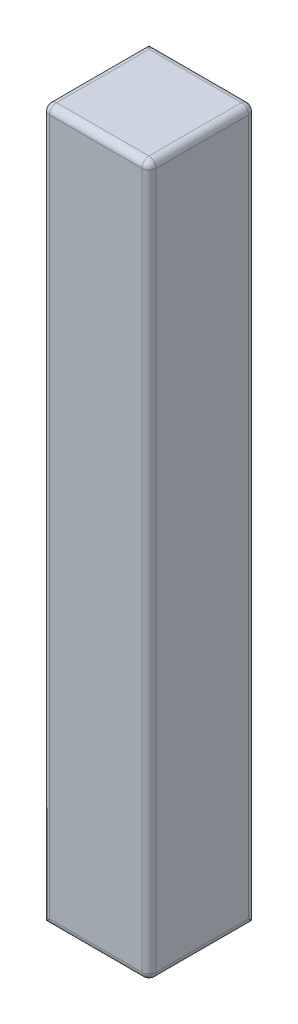
ISO-10303-21;
HEADER;
FILE_DESCRIPTION(('STEP AP214'),'2;1');
FILE_NAME('part.step','',(''),(''),'','','');
FILE_SCHEMA(('AUTOMOTIVE_DESIGN { 1 0 10303 214 1 1 1 1 }'));
ENDSEC;
DATA;
#1=APPLICATION_CONTEXT('core data for automotive mechanical design processes');
#2=APPLICATION_PROTOCOL_DEFINITION('international standard','automotive_design',2000,#1);
#3=PRODUCT_CONTEXT('',#1,'mechanical');
#4=PRODUCT('Part','Part','',(#3));
#5=PRODUCT_RELATED_PRODUCT_CATEGORY('part','',(#4));
#6=PRODUCT_DEFINITION_FORMATION('','',#4);
#7=PRODUCT_DEFINITION_CONTEXT('part definition',#1,'design');
#8=PRODUCT_DEFINITION('design','',#6,#7);
#9=PRODUCT_DEFINITION_SHAPE('','',#8);
#10=(LENGTH_UNIT() NAMED_UNIT(*) SI_UNIT(.MILLI.,.METRE.));
#11=(NAMED_UNIT(*) PLANE_ANGLE_UNIT() SI_UNIT($,.RADIAN.));
#12=(NAMED_UNIT(*) SI_UNIT($,.STERADIAN.) SOLID_ANGLE_UNIT());
#13=UNCERTAINTY_MEASURE_WITH_UNIT(LENGTH_MEASURE(1.E-05),#10,'distance_accuracy_value','');
#14=(GEOMETRIC_REPRESENTATION_CONTEXT(3) GLOBAL_UNCERTAINTY_ASSIGNED_CONTEXT((#13)) GLOBAL_UNIT_ASSIGNED_CONTEXT((#10,
#11,#12)) REPRESENTATION_CONTEXT('',''));
#15=CARTESIAN_POINT('',(0.,0.,0.));
#16=DIRECTION('',(0.,0.,1.));
#17=DIRECTION('',(1.,0.,0.));
#18=AXIS2_PLACEMENT_3D('',#15,#16,#17);
#19=CARTESIAN_POINT('',(0.,20.,0.));
#20=DIRECTION('',(1.,0.,0.));
#21=DIRECTION('',(0.,0.,-1.));
#22=AXIS2_PLACEMENT_3D('',#19,#20,#21);
#23=PLANE('',#22);
#24=DIRECTION('',(0.,-1.,0.));
#25=VECTOR('',#24,1.);
#26=CARTESIAN_POINT('',(0.,20.,-0.2));
#27=LINE('',#26,#25);
#28=CARTESIAN_POINT('',(0.,0.,-0.2));
#29=VERTEX_POINT('',#28);
#30=CARTESIAN_POINT('',(0.,19.8,-0.2));
#31=VERTEX_POINT('',#30);
#32=EDGE_CURVE('E57',#29,#31,#27,.F.);
#33=ORIENTED_EDGE('',*,*,#32,.T.);
#34=DIRECTION('',(0.,0.,1.));
#35=VECTOR('',#34,1.);
#36=CARTESIAN_POINT('',(0.,19.8,0.));
#37=LINE('',#36,#35);
#38=CARTESIAN_POINT('',(0.,19.8,-3.));
#39=VERTEX_POINT('',#38);
#40=EDGE_CURVE('E111',#31,#39,#37,.F.);
#41=ORIENTED_EDGE('',*,*,#40,.T.);
#42=DIRECTION('',(0.,-1.,0.));
#43=VECTOR('',#42,1.);
#44=CARTESIAN_POINT('',(0.,20.,-3.));
#45=LINE('',#44,#43);
#46=CARTESIAN_POINT('',(0.,0.,-3.));
#47=VERTEX_POINT('',#46);
#48=EDGE_CURVE('E107',#39,#47,#45,.T.);
#49=ORIENTED_EDGE('',*,*,#48,.T.);
#50=DIRECTION('',(0.,0.,1.));
#51=VECTOR('',#50,1.);
#52=CARTESIAN_POINT('',(0.,0.,0.));
#53=LINE('',#52,#51);
#54=EDGE_CURVE('E110',#47,#29,#53,.T.);
#55=ORIENTED_EDGE('',*,*,#54,.T.);
#56=EDGE_LOOP('',(#33,#41,#49,#55));
#57=FACE_BOUND('',#56,.T.);
#58=ADVANCED_FACE('F34',(#57),#23,.F.);
#59=CARTESIAN_POINT('',(0.,20.,0.));
#60=DIRECTION('',(0.,0.,-1.));
#61=DIRECTION('',(-1.,0.,0.));
#62=AXIS2_PLACEMENT_3D('',#59,#60,#61);
#63=PLANE('',#62);
#64=DIRECTION('',(1.,0.,0.));
#65=VECTOR('',#64,1.);
#66=CARTESIAN_POINT('',(3.,0.199999999999999,0.));
#67=LINE('',#66,#65);
#68=CARTESIAN_POINT('',(0.2,0.199999999999999,0.));
#69=VERTEX_POINT('',#68);
#70=CARTESIAN_POINT('',(2.8,0.199999999999999,0.));
#71=VERTEX_POINT('',#70);
#72=EDGE_CURVE('E132',#69,#71,#67,.T.);
#73=ORIENTED_EDGE('',*,*,#72,.T.);
#74=DIRECTION('',(0.,-1.,0.));
#75=VECTOR('',#74,1.);
#76=CARTESIAN_POINT('',(2.8,20.,0.));
#77=LINE('',#76,#75);
#78=CARTESIAN_POINT('',(2.8,19.8,0.));
#79=VERTEX_POINT('',#78);
#80=EDGE_CURVE('E135',#71,#79,#77,.F.);
#81=ORIENTED_EDGE('',*,*,#80,.T.);
#82=DIRECTION('',(1.,0.,0.));
#83=VECTOR('',#82,1.);
#84=CARTESIAN_POINT('',(0.,19.8,0.));
#85=LINE('',#84,#83);
#86=CARTESIAN_POINT('',(0.2,19.8,0.));
#87=VERTEX_POINT('',#86);
#88=EDGE_CURVE('E130',#79,#87,#85,.F.);
#89=ORIENTED_EDGE('',*,*,#88,.T.);
#90=DIRECTION('',(0.,-1.,0.));
#91=VECTOR('',#90,1.);
#92=CARTESIAN_POINT('',(0.2,20.,0.));
#93=LINE('',#92,#91);
#94=EDGE_CURVE('E112',#87,#69,#93,.T.);
#95=ORIENTED_EDGE('',*,*,#94,.T.);
#96=EDGE_LOOP('',(#73,#81,#89,#95));
#97=FACE_BOUND('',#96,.T.);
#98=ADVANCED_FACE('F236',(#97),#63,.F.);
#99=CARTESIAN_POINT('',(3.,20.,0.));
#100=DIRECTION('',(-1.,0.,0.));
#101=DIRECTION('',(0.,0.,1.));
#102=AXIS2_PLACEMENT_3D('',#99,#100,#101);
#103=PLANE('',#102);
#104=DIRECTION('',(0.,0.,-1.));
#105=VECTOR('',#104,1.);
#106=CARTESIAN_POINT('',(3.,0.199999999999999,-3.));
#107=LINE('',#106,#105);
#108=CARTESIAN_POINT('',(3.,0.199999999999999,-0.2));
#109=VERTEX_POINT('',#108);
#110=CARTESIAN_POINT('',(3.,0.199999999999999,-2.8));
#111=VERTEX_POINT('',#110);
#112=EDGE_CURVE('E144',#109,#111,#107,.T.);
#113=ORIENTED_EDGE('',*,*,#112,.T.);
#114=DIRECTION('',(0.,-1.,0.));
#115=VECTOR('',#114,1.);
#116=CARTESIAN_POINT('',(3.,20.,-2.8));
#117=LINE('',#116,#115);
#118=CARTESIAN_POINT('',(3.,19.8,-2.8));
#119=VERTEX_POINT('',#118);
#120=EDGE_CURVE('E147',#111,#119,#117,.F.);
#121=ORIENTED_EDGE('',*,*,#120,.T.);
#122=DIRECTION('',(0.,0.,-1.));
#123=VECTOR('',#122,1.);
#124=CARTESIAN_POINT('',(3.,19.8,0.));
#125=LINE('',#124,#123);
#126=CARTESIAN_POINT('',(3.,19.8,-0.2));
#127=VERTEX_POINT('',#126);
#128=EDGE_CURVE('E142',#119,#127,#125,.F.);
#129=ORIENTED_EDGE('',*,*,#128,.T.);
#130=DIRECTION('',(0.,-1.,0.));
#131=VECTOR('',#130,1.);
#132=CARTESIAN_POINT('',(3.,20.,-0.2));
#133=LINE('',#132,#131);
#134=EDGE_CURVE('E140',#127,#109,#133,.T.);
#135=ORIENTED_EDGE('',*,*,#134,.T.);
#136=EDGE_LOOP('',(#113,#121,#129,#135));
#137=FACE_BOUND('',#136,.T.);
#138=ADVANCED_FACE('F213',(#137),#103,.F.);
#139=CARTESIAN_POINT('',(0.,20.,-3.));
#140=DIRECTION('',(0.,0.,1.));
#141=DIRECTION('',(1.,0.,0.));
#142=AXIS2_PLACEMENT_3D('',#139,#140,#141);
#143=PLANE('',#142);
#144=ORIENTED_EDGE('',*,*,#48,.F.);
#145=DIRECTION('',(-1.,0.,0.));
#146=VECTOR('',#145,1.);
#147=CARTESIAN_POINT('',(0.,19.8,-3.));
#148=LINE('',#147,#146);
#149=CARTESIAN_POINT('',(2.8,19.8,-3.));
#150=VERTEX_POINT('',#149);
#151=EDGE_CURVE('E11',#39,#150,#148,.F.);
#152=ORIENTED_EDGE('',*,*,#151,.T.);
#153=DIRECTION('',(0.,-1.,0.));
#154=VECTOR('',#153,1.);
#155=CARTESIAN_POINT('',(2.8,20.,-3.));
#156=LINE('',#155,#154);
#157=CARTESIAN_POINT('',(2.8,0.,-3.));
#158=VERTEX_POINT('',#157);
#159=EDGE_CURVE('E43',#150,#158,#156,.T.);
#160=ORIENTED_EDGE('',*,*,#159,.T.);
#161=DIRECTION('',(-1.,0.,0.));
#162=VECTOR('',#161,1.);
#163=CARTESIAN_POINT('',(0.,0.,-3.));
#164=LINE('',#163,#162);
#165=EDGE_CURVE('E113',#158,#47,#164,.T.);
#166=ORIENTED_EDGE('',*,*,#165,.T.);
#167=EDGE_LOOP('',(#144,#152,#160,#166));
#168=FACE_BOUND('',#167,.T.);
#169=ADVANCED_FACE('F116',(#168),#143,.F.);
#170=CARTESIAN_POINT('',(0.,20.,0.));
#171=DIRECTION('',(0.,-1.,0.));
#172=DIRECTION('',(0.,0.,-1.));
#173=AXIS2_PLACEMENT_3D('',#170,#171,#172);
#174=PLANE('',#173);
#175=DIRECTION('',(-1.,0.,0.));
#176=VECTOR('',#175,1.);
#177=CARTESIAN_POINT('',(0.,20.,-2.8));
#178=LINE('',#177,#176);
#179=CARTESIAN_POINT('',(2.8,20.,-2.8));
#180=VERTEX_POINT('',#179);
#181=CARTESIAN_POINT('',(0.199999999999997,20.,-2.8));
#182=VERTEX_POINT('',#181);
#183=EDGE_CURVE('E149',#180,#182,#178,.T.);
#184=ORIENTED_EDGE('',*,*,#183,.T.);
#185=DIRECTION('',(0.,0.,1.));
#186=VECTOR('',#185,1.);
#187=CARTESIAN_POINT('',(0.2,20.,0.));
#188=LINE('',#187,#186);
#189=CARTESIAN_POINT('',(0.2,20.,-0.2));
#190=VERTEX_POINT('',#189);
#191=EDGE_CURVE('E155',#182,#190,#188,.T.);
#192=ORIENTED_EDGE('',*,*,#191,.T.);
#193=DIRECTION('',(1.,0.,0.));
#194=VECTOR('',#193,1.);
#195=CARTESIAN_POINT('',(0.,20.,-0.2));
#196=LINE('',#195,#194);
#197=CARTESIAN_POINT('',(2.8,20.,-0.2));
#198=VERTEX_POINT('',#197);
#199=EDGE_CURVE('E153',#190,#198,#196,.T.);
#200=ORIENTED_EDGE('',*,*,#199,.T.);
#201=DIRECTION('',(0.,0.,-1.));
#202=VECTOR('',#201,1.);
#203=CARTESIAN_POINT('',(2.8,20.,0.));
#204=LINE('',#203,#202);
#205=EDGE_CURVE('E151',#198,#180,#204,.T.);
#206=ORIENTED_EDGE('',*,*,#205,.T.);
#207=EDGE_LOOP('',(#184,#192,#200,#206));
#208=FACE_BOUND('',#207,.T.);
#209=ADVANCED_FACE('F250',(#208),#174,.F.);
#210=CARTESIAN_POINT('',(0.,0.,0.));
#211=DIRECTION('',(0.,-1.,0.));
#212=DIRECTION('',(0.,0.,-1.));
#213=AXIS2_PLACEMENT_3D('',#210,#211,#212);
#214=PLANE('',#213);
#215=DIRECTION('',(0.,0.,-1.));
#216=VECTOR('',#215,1.);
#217=CARTESIAN_POINT('',(2.8,0.,0.));
#218=LINE('',#217,#216);
#219=CARTESIAN_POINT('',(2.8,0.,-0.2));
#220=VERTEX_POINT('',#219);
#221=EDGE_CURVE('E137',#158,#220,#218,.F.);
#222=ORIENTED_EDGE('',*,*,#221,.T.);
#223=DIRECTION('',(1.,0.,0.));
#224=VECTOR('',#223,1.);
#225=CARTESIAN_POINT('',(0.,0.,-0.2));
#226=LINE('',#225,#224);
#227=EDGE_CURVE('E124',#220,#29,#226,.F.);
#228=ORIENTED_EDGE('',*,*,#227,.T.);
#229=ORIENTED_EDGE('',*,*,#54,.F.);
#230=ORIENTED_EDGE('',*,*,#165,.F.);
#231=EDGE_LOOP('',(#222,#228,#229,#230));
#232=FACE_BOUND('',#231,.T.);
#233=ADVANCED_FACE('F122',(#232),#214,.T.);
#234=CARTESIAN_POINT('',(0.,19.8,-2.8));
#235=DIRECTION('',(-1.,0.,0.));
#236=DIRECTION('',(0.,0.,1.));
#237=AXIS2_PLACEMENT_3D('',#234,#235,#236);
#238=CYLINDRICAL_SURFACE('',#237,0.2);
#239=CARTESIAN_POINT('',(0.199999999999997,19.8,-2.8));
#240=DIRECTION('',(-0.707106781186547,0.,0.707106781186548));
#241=DIRECTION('',(-0.707106781186548,0.,-0.707106781186547));
#242=AXIS2_PLACEMENT_3D('',#239,#240,#241);
#243=ELLIPSE('',#242,0.282842712474619,0.2);
#244=EDGE_CURVE('E193',#182,#39,#243,.T.);
#245=ORIENTED_EDGE('',*,*,#244,.F.);
#246=ORIENTED_EDGE('',*,*,#183,.F.);
#247=CARTESIAN_POINT('',(2.8,19.8,-2.8));
#248=DIRECTION('',(1.,0.,0.));
#249=DIRECTION('',(0.,0.,-1.));
#250=AXIS2_PLACEMENT_3D('',#247,#248,#249);
#251=CIRCLE('',#250,0.2);
#252=EDGE_CURVE('E127',#150,#180,#251,.T.);
#253=ORIENTED_EDGE('',*,*,#252,.F.);
#254=ORIENTED_EDGE('',*,*,#151,.F.);
#255=EDGE_LOOP('',(#245,#246,#253,#254));
#256=FACE_BOUND('',#255,.T.);
#257=ADVANCED_FACE('F36',(#256),#238,.T.);
#258=CARTESIAN_POINT('',(2.8,19.8,0.));
#259=DIRECTION('',(0.,0.,-1.));
#260=DIRECTION('',(-1.,0.,0.));
#261=AXIS2_PLACEMENT_3D('',#258,#259,#260);
#262=CYLINDRICAL_SURFACE('',#261,0.2);
#263=CARTESIAN_POINT('',(2.8,19.8,-2.8));
#264=DIRECTION('',(0.,0.,-1.));
#265=DIRECTION('',(-1.,0.,0.));
#266=AXIS2_PLACEMENT_3D('',#263,#264,#265);
#267=CIRCLE('',#266,0.2);
#268=EDGE_CURVE('E38',#180,#119,#267,.T.);
#269=ORIENTED_EDGE('',*,*,#268,.F.);
#270=ORIENTED_EDGE('',*,*,#205,.F.);
#271=CARTESIAN_POINT('',(2.8,19.8,-0.2));
#272=DIRECTION('',(0.,0.,1.));
#273=DIRECTION('',(1.,0.,0.));
#274=AXIS2_PLACEMENT_3D('',#271,#272,#273);
#275=CIRCLE('',#274,0.2);
#276=EDGE_CURVE('E187',#127,#198,#275,.T.);
#277=ORIENTED_EDGE('',*,*,#276,.F.);
#278=ORIENTED_EDGE('',*,*,#128,.F.);
#279=EDGE_LOOP('',(#269,#270,#277,#278));
#280=FACE_BOUND('',#279,.T.);
#281=ADVANCED_FACE('F208',(#280),#262,.T.);
#282=CARTESIAN_POINT('',(2.8,19.8,-2.8));
#283=DIRECTION('',(0.,0.,1.));
#284=DIRECTION('',(1.,0.,0.));
#285=AXIS2_PLACEMENT_3D('',#282,#283,#284);
#286=SPHERICAL_SURFACE('',#285,0.2);
#287=ORIENTED_EDGE('',*,*,#252,.T.);
#288=ORIENTED_EDGE('',*,*,#268,.T.);
#289=CARTESIAN_POINT('',(2.8,19.8,-2.8));
#290=DIRECTION('',(0.,1.,0.));
#291=DIRECTION('',(0.,0.,1.));
#292=AXIS2_PLACEMENT_3D('',#289,#290,#291);
#293=CIRCLE('',#292,0.2);
#294=EDGE_CURVE('E184',#150,#119,#293,.F.);
#295=ORIENTED_EDGE('',*,*,#294,.F.);
#296=EDGE_LOOP('',(#287,#288,#295));
#297=FACE_BOUND('',#296,.T.);
#298=ADVANCED_FACE('F198',(#297),#286,.T.);
#299=CARTESIAN_POINT('',(0.2,19.8,0.));
#300=DIRECTION('',(0.,0.,1.));
#301=DIRECTION('',(1.,0.,0.));
#302=AXIS2_PLACEMENT_3D('',#299,#300,#301);
#303=CYLINDRICAL_SURFACE('',#302,0.2);
#304=ORIENTED_EDGE('',*,*,#244,.T.);
#305=ORIENTED_EDGE('',*,*,#40,.F.);
#306=CARTESIAN_POINT('',(0.2,19.8,-0.2));
#307=DIRECTION('',(0.,0.,1.));
#308=DIRECTION('',(1.,0.,0.));
#309=AXIS2_PLACEMENT_3D('',#306,#307,#308);
#310=CIRCLE('',#309,0.2);
#311=EDGE_CURVE('E181',#190,#31,#310,.T.);
#312=ORIENTED_EDGE('',*,*,#311,.F.);
#313=ORIENTED_EDGE('',*,*,#191,.F.);
#314=EDGE_LOOP('',(#304,#305,#312,#313));
#315=FACE_BOUND('',#314,.T.);
#316=ADVANCED_FACE('F247',(#315),#303,.T.);
#317=CARTESIAN_POINT('',(0.,19.8,-0.2));
#318=DIRECTION('',(1.,0.,0.));
#319=DIRECTION('',(0.,0.,-1.));
#320=AXIS2_PLACEMENT_3D('',#317,#318,#319);
#321=CYLINDRICAL_SURFACE('',#320,0.2);
#322=CARTESIAN_POINT('',(2.8,19.8,-0.2));
#323=DIRECTION('',(1.,0.,0.));
#324=DIRECTION('',(0.,0.,-1.));
#325=AXIS2_PLACEMENT_3D('',#322,#323,#324);
#326=CIRCLE('',#325,0.2);
#327=EDGE_CURVE('E190',#198,#79,#326,.T.);
#328=ORIENTED_EDGE('',*,*,#327,.F.);
#329=ORIENTED_EDGE('',*,*,#199,.F.);
#330=CARTESIAN_POINT('',(0.2,19.8,-0.2));
#331=DIRECTION('',(-1.,0.,0.));
#332=DIRECTION('',(0.,0.,1.));
#333=AXIS2_PLACEMENT_3D('',#330,#331,#332);
#334=CIRCLE('',#333,0.2);
#335=EDGE_CURVE('E179',#87,#190,#334,.T.);
#336=ORIENTED_EDGE('',*,*,#335,.F.);
#337=ORIENTED_EDGE('',*,*,#88,.F.);
#338=EDGE_LOOP('',(#328,#329,#336,#337));
#339=FACE_BOUND('',#338,.T.);
#340=ADVANCED_FACE('F249',(#339),#321,.T.);
#341=CARTESIAN_POINT('',(2.8,19.8,-0.2));
#342=DIRECTION('',(0.,0.,1.));
#343=DIRECTION('',(1.,0.,0.));
#344=AXIS2_PLACEMENT_3D('',#341,#342,#343);
#345=SPHERICAL_SURFACE('',#344,0.2);
#346=ORIENTED_EDGE('',*,*,#276,.T.);
#347=ORIENTED_EDGE('',*,*,#327,.T.);
#348=CARTESIAN_POINT('',(2.8,19.8,-0.2));
#349=DIRECTION('',(0.,1.,0.));
#350=DIRECTION('',(0.,0.,1.));
#351=AXIS2_PLACEMENT_3D('',#348,#349,#350);
#352=CIRCLE('',#351,0.2);
#353=EDGE_CURVE('E176',#127,#79,#352,.F.);
#354=ORIENTED_EDGE('',*,*,#353,.F.);
#355=EDGE_LOOP('',(#346,#347,#354));
#356=FACE_BOUND('',#355,.T.);
#357=ADVANCED_FACE('F281',(#356),#345,.T.);
#358=CARTESIAN_POINT('',(2.8,20.,-2.8));
#359=DIRECTION('',(0.,-1.,0.));
#360=DIRECTION('',(0.,0.,-1.));
#361=AXIS2_PLACEMENT_3D('',#358,#359,#360);
#362=CYLINDRICAL_SURFACE('',#361,0.2);
#363=ORIENTED_EDGE('',*,*,#294,.T.);
#364=ORIENTED_EDGE('',*,*,#120,.F.);
#365=CARTESIAN_POINT('',(2.8,0.199999999999999,-2.8));
#366=DIRECTION('',(0.,-0.707106781186547,0.707106781186547));
#367=DIRECTION('',(0.,-0.707106781186547,-0.707106781186547));
#368=AXIS2_PLACEMENT_3D('',#365,#366,#367);
#369=ELLIPSE('',#368,0.282842712474619,0.2);
#370=EDGE_CURVE('E174',#158,#111,#369,.T.);
#371=ORIENTED_EDGE('',*,*,#370,.F.);
#372=ORIENTED_EDGE('',*,*,#159,.F.);
#373=EDGE_LOOP('',(#363,#364,#371,#372));
#374=FACE_BOUND('',#373,.T.);
#375=ADVANCED_FACE('F218',(#374),#362,.T.);
#376=CARTESIAN_POINT('',(0.2,19.8,-0.2));
#377=DIRECTION('',(0.,0.,1.));
#378=DIRECTION('',(1.,0.,0.));
#379=AXIS2_PLACEMENT_3D('',#376,#377,#378);
#380=SPHERICAL_SURFACE('',#379,0.2);
#381=ORIENTED_EDGE('',*,*,#335,.T.);
#382=ORIENTED_EDGE('',*,*,#311,.T.);
#383=CARTESIAN_POINT('',(0.2,19.8,-0.2));
#384=DIRECTION('',(0.,1.,0.));
#385=DIRECTION('',(0.,0.,1.));
#386=AXIS2_PLACEMENT_3D('',#383,#384,#385);
#387=CIRCLE('',#386,0.2);
#388=EDGE_CURVE('E171',#87,#31,#387,.F.);
#389=ORIENTED_EDGE('',*,*,#388,.F.);
#390=EDGE_LOOP('',(#381,#382,#389));
#391=FACE_BOUND('',#390,.T.);
#392=ADVANCED_FACE('F243',(#391),#380,.T.);
#393=CARTESIAN_POINT('',(2.8,20.,-0.2));
#394=DIRECTION('',(0.,-1.,0.));
#395=DIRECTION('',(0.,0.,-1.));
#396=AXIS2_PLACEMENT_3D('',#393,#394,#395);
#397=CYLINDRICAL_SURFACE('',#396,0.2);
#398=ORIENTED_EDGE('',*,*,#353,.T.);
#399=ORIENTED_EDGE('',*,*,#80,.F.);
#400=CARTESIAN_POINT('',(2.8,0.199999999999999,-0.2));
#401=DIRECTION('',(0.,-1.,0.));
#402=DIRECTION('',(0.,0.,-1.));
#403=AXIS2_PLACEMENT_3D('',#400,#401,#402);
#404=CIRCLE('',#403,0.2);
#405=EDGE_CURVE('E168',#109,#71,#404,.T.);
#406=ORIENTED_EDGE('',*,*,#405,.F.);
#407=ORIENTED_EDGE('',*,*,#134,.F.);
#408=EDGE_LOOP('',(#398,#399,#406,#407));
#409=FACE_BOUND('',#408,.T.);
#410=ADVANCED_FACE('F233',(#409),#397,.T.);
#411=CARTESIAN_POINT('',(2.8,0.199999999999999,0.));
#412=DIRECTION('',(0.,0.,1.));
#413=DIRECTION('',(1.,0.,0.));
#414=AXIS2_PLACEMENT_3D('',#411,#412,#413);
#415=CYLINDRICAL_SURFACE('',#414,0.2);
#416=ORIENTED_EDGE('',*,*,#370,.T.);
#417=ORIENTED_EDGE('',*,*,#112,.F.);
#418=CARTESIAN_POINT('',(2.8,0.2,-0.2));
#419=DIRECTION('',(0.,0.,1.));
#420=DIRECTION('',(1.,0.,0.));
#421=AXIS2_PLACEMENT_3D('',#418,#419,#420);
#422=CIRCLE('',#421,0.2);
#423=EDGE_CURVE('E165',#220,#109,#422,.T.);
#424=ORIENTED_EDGE('',*,*,#423,.F.);
#425=ORIENTED_EDGE('',*,*,#221,.F.);
#426=EDGE_LOOP('',(#416,#417,#424,#425));
#427=FACE_BOUND('',#426,.T.);
#428=ADVANCED_FACE('F222',(#427),#415,.T.);
#429=CARTESIAN_POINT('',(0.2,20.,-0.2));
#430=DIRECTION('',(0.,-1.,0.));
#431=DIRECTION('',(0.,0.,-1.));
#432=AXIS2_PLACEMENT_3D('',#429,#430,#431);
#433=CYLINDRICAL_SURFACE('',#432,0.2);
#434=ORIENTED_EDGE('',*,*,#388,.T.);
#435=ORIENTED_EDGE('',*,*,#32,.F.);
#436=CARTESIAN_POINT('',(0.2,0.199999999999999,-0.2));
#437=DIRECTION('',(0.707106781186547,-0.707106781186547,0.));
#438=DIRECTION('',(-0.707106781186547,-0.707106781186547,0.));
#439=AXIS2_PLACEMENT_3D('',#436,#437,#438);
#440=ELLIPSE('',#439,0.282842712474619,0.2);
#441=EDGE_CURVE('E163',#69,#29,#440,.T.);
#442=ORIENTED_EDGE('',*,*,#441,.F.);
#443=ORIENTED_EDGE('',*,*,#94,.F.);
#444=EDGE_LOOP('',(#434,#435,#442,#443));
#445=FACE_BOUND('',#444,.T.);
#446=ADVANCED_FACE('F240',(#445),#433,.T.);
#447=CARTESIAN_POINT('',(2.8,0.2,-0.2));
#448=DIRECTION('',(0.,0.,1.));
#449=DIRECTION('',(1.,0.,0.));
#450=AXIS2_PLACEMENT_3D('',#447,#448,#449);
#451=SPHERICAL_SURFACE('',#450,0.2);
#452=ORIENTED_EDGE('',*,*,#423,.T.);
#453=ORIENTED_EDGE('',*,*,#405,.T.);
#454=CARTESIAN_POINT('',(2.8,0.199999999999999,-0.2));
#455=DIRECTION('',(1.,0.,0.));
#456=DIRECTION('',(0.,0.,-1.));
#457=AXIS2_PLACEMENT_3D('',#454,#455,#456);
#458=CIRCLE('',#457,0.2);
#459=EDGE_CURVE('E161',#220,#71,#458,.F.);
#460=ORIENTED_EDGE('',*,*,#459,.F.);
#461=EDGE_LOOP('',(#452,#453,#460));
#462=FACE_BOUND('',#461,.T.);
#463=ADVANCED_FACE('F230',(#462),#451,.T.);
#464=CARTESIAN_POINT('',(0.,0.199999999999999,-0.2));
#465=DIRECTION('',(-1.,0.,0.));
#466=DIRECTION('',(0.,0.,1.));
#467=AXIS2_PLACEMENT_3D('',#464,#465,#466);
#468=CYLINDRICAL_SURFACE('',#467,0.2);
#469=ORIENTED_EDGE('',*,*,#441,.T.);
#470=ORIENTED_EDGE('',*,*,#227,.F.);
#471=ORIENTED_EDGE('',*,*,#459,.T.);
#472=ORIENTED_EDGE('',*,*,#72,.F.);
#473=EDGE_LOOP('',(#469,#470,#471,#472));
#474=FACE_BOUND('',#473,.T.);
#475=ADVANCED_FACE('F227',(#474),#468,.T.);
#476=CLOSED_SHELL('',(#58,#98,#138,#169,#209,#233,#257,#281,#298,#316,#340,#357,#375,#392,#410,
#428,#446,#463,#475));
#477=MANIFOLD_SOLID_BREP('B2',#476);
#478=ADVANCED_BREP_SHAPE_REPRESENTATION('',(#18,#477),#14);
#479=SHAPE_DEFINITION_REPRESENTATION(#9,#478);
ENDSEC;
END-ISO-10303-21;
